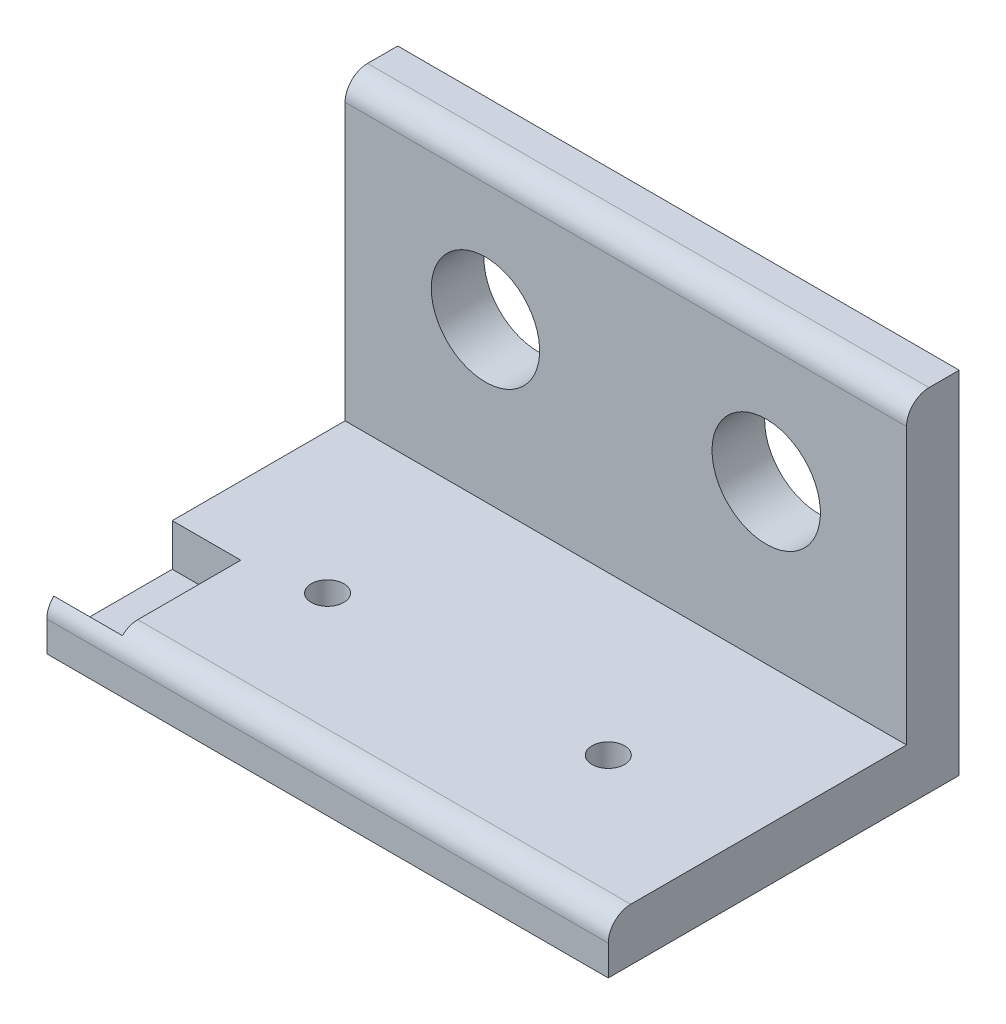
ISO-10303-21;
HEADER;
FILE_DESCRIPTION(('STEP AP214'),'2;1');
FILE_NAME('part.step','',(''),(''),'','','');
FILE_SCHEMA(('AUTOMOTIVE_DESIGN { 1 0 10303 214 1 1 1 1 }'));
ENDSEC;
DATA;
#1=APPLICATION_CONTEXT('core data for automotive mechanical design processes');
#2=APPLICATION_PROTOCOL_DEFINITION('international standard','automotive_design',2000,#1);
#3=PRODUCT_CONTEXT('',#1,'mechanical');
#4=PRODUCT('Part','Part','',(#3));
#5=PRODUCT_RELATED_PRODUCT_CATEGORY('part','',(#4));
#6=PRODUCT_DEFINITION_FORMATION('','',#4);
#7=PRODUCT_DEFINITION_CONTEXT('part definition',#1,'design');
#8=PRODUCT_DEFINITION('design','',#6,#7);
#9=PRODUCT_DEFINITION_SHAPE('','',#8);
#10=(LENGTH_UNIT() NAMED_UNIT(*) SI_UNIT(.MILLI.,.METRE.));
#11=(NAMED_UNIT(*) PLANE_ANGLE_UNIT() SI_UNIT($,.RADIAN.));
#12=(NAMED_UNIT(*) SI_UNIT($,.STERADIAN.) SOLID_ANGLE_UNIT());
#13=UNCERTAINTY_MEASURE_WITH_UNIT(LENGTH_MEASURE(1.E-05),#10,'distance_accuracy_value','');
#14=(GEOMETRIC_REPRESENTATION_CONTEXT(3) GLOBAL_UNCERTAINTY_ASSIGNED_CONTEXT((#13)) GLOBAL_UNIT_ASSIGNED_CONTEXT((#10,
#11,#12)) REPRESENTATION_CONTEXT('',''));
#15=CARTESIAN_POINT('',(0.,0.,0.));
#16=DIRECTION('',(0.,0.,1.));
#17=DIRECTION('',(1.,0.,0.));
#18=AXIS2_PLACEMENT_3D('',#15,#16,#17);
#19=CARTESIAN_POINT('',(0.,4.7625,0.));
#20=DIRECTION('',(0.,1.,0.));
#21=DIRECTION('',(0.,0.,1.));
#22=AXIS2_PLACEMENT_3D('',#19,#20,#21);
#23=PLANE('',#22);
#24=DIRECTION('',(-1.,0.,0.));
#25=VECTOR('',#24,1.);
#26=CARTESIAN_POINT('',(-0.348509109865628,4.7625,20.3992044382791));
#27=LINE('',#26,#25);
#28=CARTESIAN_POINT('',(6.20120884697613,4.7625,20.3992044382791));
#29=VERTEX_POINT('',#28);
#30=CARTESIAN_POINT('',(0.,4.7625,20.3992044382791));
#31=VERTEX_POINT('',#30);
#32=EDGE_CURVE('E132',#29,#31,#27,.T.);
#33=ORIENTED_EDGE('',*,*,#32,.F.);
#34=DIRECTION('',(0.,0.,-1.));
#35=VECTOR('',#34,1.);
#36=CARTESIAN_POINT('',(6.20120884697613,4.7625,31.1129814935099));
#37=LINE('',#36,#35);
#38=CARTESIAN_POINT('',(6.20120884697613,4.7625,29.718));
#39=VERTEX_POINT('',#38);
#40=EDGE_CURVE('E148',#39,#29,#37,.T.);
#41=ORIENTED_EDGE('',*,*,#40,.F.);
#42=DIRECTION('',(1.,0.,0.));
#43=VECTOR('',#42,1.);
#44=CARTESIAN_POINT('',(50.8,4.7625,29.718));
#45=LINE('',#44,#43);
#46=CARTESIAN_POINT('',(50.8,4.7625,29.718));
#47=VERTEX_POINT('',#46);
#48=EDGE_CURVE('E226',#39,#47,#45,.T.);
#49=ORIENTED_EDGE('',*,*,#48,.T.);
#50=DIRECTION('',(0.,0.,-1.));
#51=VECTOR('',#50,1.);
#52=CARTESIAN_POINT('',(50.8,4.7625,0.));
#53=LINE('',#52,#51);
#54=CARTESIAN_POINT('',(50.8,4.7625,4.7625));
#55=VERTEX_POINT('',#54);
#56=EDGE_CURVE('E192',#47,#55,#53,.T.);
#57=ORIENTED_EDGE('',*,*,#56,.T.);
#58=DIRECTION('',(-1.,0.,0.));
#59=VECTOR('',#58,1.);
#60=CARTESIAN_POINT('',(0.,4.7625,4.7625));
#61=LINE('',#60,#59);
#62=CARTESIAN_POINT('',(0.,4.7625,4.7625));
#63=VERTEX_POINT('',#62);
#64=EDGE_CURVE('E185',#55,#63,#61,.T.);
#65=ORIENTED_EDGE('',*,*,#64,.T.);
#66=DIRECTION('',(0.,0.,1.));
#67=VECTOR('',#66,1.);
#68=CARTESIAN_POINT('',(0.,4.7625,0.));
#69=LINE('',#68,#67);
#70=EDGE_CURVE('E189',#63,#31,#69,.T.);
#71=ORIENTED_EDGE('',*,*,#70,.T.);
#72=EDGE_LOOP('',(#33,#41,#49,#57,#65,#71));
#73=FACE_BOUND('',#72,.T.);
#74=CARTESIAN_POINT('',(38.1,4.7625,19.05));
#75=DIRECTION('',(0.,1.,0.));
#76=DIRECTION('',(0.,0.,1.));
#77=AXIS2_PLACEMENT_3D('',#74,#75,#76);
#78=CIRCLE('',#77,1.47319999999999);
#79=CARTESIAN_POINT('',(38.1,4.7625,20.5232));
#80=VERTEX_POINT('',#79);
#81=EDGE_CURVE('E164',#80,#80,#78,.T.);
#82=ORIENTED_EDGE('',*,*,#81,.F.);
#83=EDGE_LOOP('',(#82));
#84=FACE_BOUND('',#83,.T.);
#85=CARTESIAN_POINT('',(12.7,4.7625,19.05));
#86=DIRECTION('',(0.,1.,0.));
#87=DIRECTION('',(0.,0.,1.));
#88=AXIS2_PLACEMENT_3D('',#85,#86,#87);
#89=CIRCLE('',#88,1.47319999999999);
#90=CARTESIAN_POINT('',(12.7,4.7625,20.5232));
#91=VERTEX_POINT('',#90);
#92=EDGE_CURVE('E170',#91,#91,#89,.T.);
#93=ORIENTED_EDGE('',*,*,#92,.F.);
#94=EDGE_LOOP('',(#93));
#95=FACE_BOUND('',#94,.T.);
#96=ADVANCED_FACE('F34',(#73,#84,#95),#23,.T.);
#97=CARTESIAN_POINT('',(0.,4.7625,0.));
#98=DIRECTION('',(1.,0.,0.));
#99=DIRECTION('',(0.,0.,-1.));
#100=AXIS2_PLACEMENT_3D('',#97,#98,#99);
#101=PLANE('',#100);
#102=DIRECTION('',(0.,0.,-1.));
#103=VECTOR('',#102,1.);
#104=CARTESIAN_POINT('',(0.,0.952500000000001,0.));
#105=LINE('',#104,#103);
#106=CARTESIAN_POINT('',(0.,0.952500000000001,31.1129814935099));
#107=VERTEX_POINT('',#106);
#108=CARTESIAN_POINT('',(0.,0.952500000000001,20.3992044382791));
#109=VERTEX_POINT('',#108);
#110=EDGE_CURVE('E42',#107,#109,#105,.T.);
#111=ORIENTED_EDGE('',*,*,#110,.T.);
#112=DIRECTION('',(0.,1.,0.));
#113=VECTOR('',#112,1.);
#114=CARTESIAN_POINT('',(0.,4.7625,20.3992044382791));
#115=LINE('',#114,#113);
#116=EDGE_CURVE('E11',#109,#31,#115,.T.);
#117=ORIENTED_EDGE('',*,*,#116,.T.);
#118=ORIENTED_EDGE('',*,*,#70,.F.);
#119=DIRECTION('',(0.,-1.,0.));
#120=VECTOR('',#119,1.);
#121=CARTESIAN_POINT('',(0.,0.,4.7625));
#122=LINE('',#121,#120);
#123=CARTESIAN_POINT('',(0.,29.718,4.7625));
#124=VERTEX_POINT('',#123);
#125=EDGE_CURVE('E174',#124,#63,#122,.T.);
#126=ORIENTED_EDGE('',*,*,#125,.F.);
#127=CARTESIAN_POINT('',(0.,29.718,2.7305));
#128=DIRECTION('',(1.,0.,0.));
#129=DIRECTION('',(0.,0.,-1.));
#130=AXIS2_PLACEMENT_3D('',#127,#128,#129);
#131=CIRCLE('',#130,2.032);
#132=CARTESIAN_POINT('',(0.,31.75,2.7305));
#133=VERTEX_POINT('',#132);
#134=EDGE_CURVE('E219',#124,#133,#131,.F.);
#135=ORIENTED_EDGE('',*,*,#134,.T.);
#136=DIRECTION('',(0.,0.,-1.));
#137=VECTOR('',#136,1.);
#138=CARTESIAN_POINT('',(0.,31.75,4.7625));
#139=LINE('',#138,#137);
#140=CARTESIAN_POINT('',(0.,31.75,0.));
#141=VERTEX_POINT('',#140);
#142=EDGE_CURVE('E179',#133,#141,#139,.T.);
#143=ORIENTED_EDGE('',*,*,#142,.T.);
#144=DIRECTION('',(0.,-1.,0.));
#145=VECTOR('',#144,1.);
#146=CARTESIAN_POINT('',(0.,4.7625,0.));
#147=LINE('',#146,#145);
#148=CARTESIAN_POINT('',(0.,0.,0.));
#149=VERTEX_POINT('',#148);
#150=EDGE_CURVE('E195',#141,#149,#147,.T.);
#151=ORIENTED_EDGE('',*,*,#150,.T.);
#152=DIRECTION('',(0.,0.,1.));
#153=VECTOR('',#152,1.);
#154=CARTESIAN_POINT('',(0.,0.,0.));
#155=LINE('',#154,#153);
#156=CARTESIAN_POINT('',(0.,0.,31.75));
#157=VERTEX_POINT('',#156);
#158=EDGE_CURVE('E188',#149,#157,#155,.T.);
#159=ORIENTED_EDGE('',*,*,#158,.T.);
#160=DIRECTION('',(0.,-1.,0.));
#161=VECTOR('',#160,1.);
#162=CARTESIAN_POINT('',(0.,4.7625,31.75));
#163=LINE('',#162,#161);
#164=CARTESIAN_POINT('',(0.,2.7305,31.75));
#165=VERTEX_POINT('',#164);
#166=EDGE_CURVE('E211',#165,#157,#163,.T.);
#167=ORIENTED_EDGE('',*,*,#166,.F.);
#168=CARTESIAN_POINT('',(0.,2.7305,29.718));
#169=DIRECTION('',(1.,0.,0.));
#170=DIRECTION('',(0.,0.,-1.));
#171=AXIS2_PLACEMENT_3D('',#168,#169,#170);
#172=CIRCLE('',#171,2.032);
#173=CARTESIAN_POINT('',(0.,4.20801501947181,31.1129814935099));
#174=VERTEX_POINT('',#173);
#175=EDGE_CURVE('E216',#165,#174,#172,.F.);
#176=ORIENTED_EDGE('',*,*,#175,.T.);
#177=DIRECTION('',(0.,-1.,0.));
#178=VECTOR('',#177,1.);
#179=CARTESIAN_POINT('',(0.,4.7625,31.1129814935099));
#180=LINE('',#179,#178);
#181=EDGE_CURVE('E49',#174,#107,#180,.T.);
#182=ORIENTED_EDGE('',*,*,#181,.T.);
#183=EDGE_LOOP('',(#111,#117,#118,#126,#135,#143,#151,#159,#167,#176,#182));
#184=FACE_BOUND('',#183,.T.);
#185=ADVANCED_FACE('F237',(#184),#101,.F.);
#186=CARTESIAN_POINT('',(0.,4.7625,31.75));
#187=DIRECTION('',(0.,0.,-1.));
#188=DIRECTION('',(-1.,0.,0.));
#189=AXIS2_PLACEMENT_3D('',#186,#187,#188);
#190=PLANE('',#189);
#191=DIRECTION('',(0.,-1.,0.));
#192=VECTOR('',#191,1.);
#193=CARTESIAN_POINT('',(50.8,4.7625,31.75));
#194=LINE('',#193,#192);
#195=CARTESIAN_POINT('',(50.8,2.7305,31.75));
#196=VERTEX_POINT('',#195);
#197=CARTESIAN_POINT('',(50.8,0.,31.75));
#198=VERTEX_POINT('',#197);
#199=EDGE_CURVE('E209',#196,#198,#194,.T.);
#200=ORIENTED_EDGE('',*,*,#199,.F.);
#201=DIRECTION('',(1.,0.,0.));
#202=VECTOR('',#201,1.);
#203=CARTESIAN_POINT('',(0.,2.7305,31.75));
#204=LINE('',#203,#202);
#205=EDGE_CURVE('E228',#196,#165,#204,.F.);
#206=ORIENTED_EDGE('',*,*,#205,.T.);
#207=ORIENTED_EDGE('',*,*,#166,.T.);
#208=DIRECTION('',(1.,0.,0.));
#209=VECTOR('',#208,1.);
#210=CARTESIAN_POINT('',(0.,0.,31.75));
#211=LINE('',#210,#209);
#212=EDGE_CURVE('E198',#157,#198,#211,.T.);
#213=ORIENTED_EDGE('',*,*,#212,.T.);
#214=EDGE_LOOP('',(#200,#206,#207,#213));
#215=FACE_BOUND('',#214,.T.);
#216=ADVANCED_FACE('F267',(#215),#190,.F.);
#217=CARTESIAN_POINT('',(50.8,4.7625,0.));
#218=DIRECTION('',(-1.,0.,0.));
#219=DIRECTION('',(0.,0.,1.));
#220=AXIS2_PLACEMENT_3D('',#217,#218,#219);
#221=PLANE('',#220);
#222=DIRECTION('',(0.,0.,-1.));
#223=VECTOR('',#222,1.);
#224=CARTESIAN_POINT('',(50.8,31.75,4.7625));
#225=LINE('',#224,#223);
#226=CARTESIAN_POINT('',(50.8,31.75,2.7305));
#227=VERTEX_POINT('',#226);
#228=CARTESIAN_POINT('',(50.8,31.75,0.));
#229=VERTEX_POINT('',#228);
#230=EDGE_CURVE('E183',#227,#229,#225,.T.);
#231=ORIENTED_EDGE('',*,*,#230,.F.);
#232=CARTESIAN_POINT('',(50.8,29.718,2.7305));
#233=DIRECTION('',(-1.,0.,0.));
#234=DIRECTION('',(0.,0.,1.));
#235=AXIS2_PLACEMENT_3D('',#232,#233,#234);
#236=CIRCLE('',#235,2.032);
#237=CARTESIAN_POINT('',(50.8,29.718,4.7625));
#238=VERTEX_POINT('',#237);
#239=EDGE_CURVE('E224',#227,#238,#236,.F.);
#240=ORIENTED_EDGE('',*,*,#239,.T.);
#241=DIRECTION('',(0.,1.,0.));
#242=VECTOR('',#241,1.);
#243=CARTESIAN_POINT('',(50.8,0.,4.7625));
#244=LINE('',#243,#242);
#245=EDGE_CURVE('E176',#55,#238,#244,.T.);
#246=ORIENTED_EDGE('',*,*,#245,.F.);
#247=ORIENTED_EDGE('',*,*,#56,.F.);
#248=CARTESIAN_POINT('',(50.8,2.7305,29.718));
#249=DIRECTION('',(-1.,0.,0.));
#250=DIRECTION('',(0.,0.,1.));
#251=AXIS2_PLACEMENT_3D('',#248,#249,#250);
#252=CIRCLE('',#251,2.032);
#253=EDGE_CURVE('E57',#47,#196,#252,.F.);
#254=ORIENTED_EDGE('',*,*,#253,.T.);
#255=ORIENTED_EDGE('',*,*,#199,.T.);
#256=DIRECTION('',(0.,0.,-1.));
#257=VECTOR('',#256,1.);
#258=CARTESIAN_POINT('',(50.8,0.,0.));
#259=LINE('',#258,#257);
#260=CARTESIAN_POINT('',(50.8,0.,0.));
#261=VERTEX_POINT('',#260);
#262=EDGE_CURVE('E201',#198,#261,#259,.T.);
#263=ORIENTED_EDGE('',*,*,#262,.T.);
#264=DIRECTION('',(0.,-1.,0.));
#265=VECTOR('',#264,1.);
#266=CARTESIAN_POINT('',(50.8,4.7625,0.));
#267=LINE('',#266,#265);
#268=EDGE_CURVE('E206',#229,#261,#267,.T.);
#269=ORIENTED_EDGE('',*,*,#268,.F.);
#270=EDGE_LOOP('',(#231,#240,#246,#247,#254,#255,#263,#269));
#271=FACE_BOUND('',#270,.T.);
#272=ADVANCED_FACE('F280',(#271),#221,.F.);
#273=CARTESIAN_POINT('',(0.,4.7625,0.));
#274=DIRECTION('',(0.,0.,1.));
#275=DIRECTION('',(1.,0.,0.));
#276=AXIS2_PLACEMENT_3D('',#273,#274,#275);
#277=PLANE('',#276);
#278=CARTESIAN_POINT('',(12.7,19.05,0.));
#279=DIRECTION('',(0.,0.,-1.));
#280=DIRECTION('',(-1.,0.,0.));
#281=AXIS2_PLACEMENT_3D('',#278,#279,#280);
#282=CIRCLE('',#281,4.90219999999999);
#283=CARTESIAN_POINT('',(7.79780000000001,19.05,0.));
#284=VERTEX_POINT('',#283);
#285=EDGE_CURVE('E153',#284,#284,#282,.T.);
#286=ORIENTED_EDGE('',*,*,#285,.F.);
#287=EDGE_LOOP('',(#286));
#288=FACE_BOUND('',#287,.T.);
#289=CARTESIAN_POINT('',(38.1,19.05,0.));
#290=DIRECTION('',(0.,0.,-1.));
#291=DIRECTION('',(-1.,0.,0.));
#292=AXIS2_PLACEMENT_3D('',#289,#290,#291);
#293=CIRCLE('',#292,4.90219999999999);
#294=CARTESIAN_POINT('',(33.1978,19.05,0.));
#295=VERTEX_POINT('',#294);
#296=EDGE_CURVE('E157',#295,#295,#293,.T.);
#297=ORIENTED_EDGE('',*,*,#296,.F.);
#298=EDGE_LOOP('',(#297));
#299=FACE_BOUND('',#298,.T.);
#300=DIRECTION('',(-1.,0.,0.));
#301=VECTOR('',#300,1.);
#302=CARTESIAN_POINT('',(0.,0.,0.));
#303=LINE('',#302,#301);
#304=EDGE_CURVE('E193',#261,#149,#303,.T.);
#305=ORIENTED_EDGE('',*,*,#304,.T.);
#306=ORIENTED_EDGE('',*,*,#150,.F.);
#307=DIRECTION('',(-1.,0.,0.));
#308=VECTOR('',#307,1.);
#309=CARTESIAN_POINT('',(0.,31.75,0.));
#310=LINE('',#309,#308);
#311=EDGE_CURVE('E173',#229,#141,#310,.T.);
#312=ORIENTED_EDGE('',*,*,#311,.F.);
#313=ORIENTED_EDGE('',*,*,#268,.T.);
#314=EDGE_LOOP('',(#305,#306,#312,#313));
#315=FACE_BOUND('',#314,.T.);
#316=ADVANCED_FACE('F276',(#288,#299,#315),#277,.F.);
#317=CARTESIAN_POINT('',(0.,0.,0.));
#318=DIRECTION('',(0.,1.,0.));
#319=DIRECTION('',(0.,0.,1.));
#320=AXIS2_PLACEMENT_3D('',#317,#318,#319);
#321=PLANE('',#320);
#322=CARTESIAN_POINT('',(38.1,0.,19.05));
#323=DIRECTION('',(0.,-1.,0.));
#324=DIRECTION('',(0.,0.,-1.));
#325=AXIS2_PLACEMENT_3D('',#322,#323,#324);
#326=CIRCLE('',#325,1.47319999999999);
#327=CARTESIAN_POINT('',(38.1,0.,17.5768));
#328=VERTEX_POINT('',#327);
#329=EDGE_CURVE('E161',#328,#328,#326,.T.);
#330=ORIENTED_EDGE('',*,*,#329,.F.);
#331=EDGE_LOOP('',(#330));
#332=FACE_BOUND('',#331,.T.);
#333=CARTESIAN_POINT('',(12.7,0.,19.05));
#334=DIRECTION('',(0.,-1.,0.));
#335=DIRECTION('',(0.,0.,-1.));
#336=AXIS2_PLACEMENT_3D('',#333,#334,#335);
#337=CIRCLE('',#336,1.47319999999999);
#338=CARTESIAN_POINT('',(12.7,0.,17.5768));
#339=VERTEX_POINT('',#338);
#340=EDGE_CURVE('E167',#339,#339,#337,.T.);
#341=ORIENTED_EDGE('',*,*,#340,.F.);
#342=EDGE_LOOP('',(#341));
#343=FACE_BOUND('',#342,.T.);
#344=ORIENTED_EDGE('',*,*,#304,.F.);
#345=ORIENTED_EDGE('',*,*,#262,.F.);
#346=ORIENTED_EDGE('',*,*,#212,.F.);
#347=ORIENTED_EDGE('',*,*,#158,.F.);
#348=EDGE_LOOP('',(#344,#345,#346,#347));
#349=FACE_BOUND('',#348,.T.);
#350=ADVANCED_FACE('F273',(#332,#343,#349),#321,.F.);
#351=CARTESIAN_POINT('',(0.,31.75,4.7625));
#352=DIRECTION('',(0.,-1.,0.));
#353=DIRECTION('',(0.,0.,-1.));
#354=AXIS2_PLACEMENT_3D('',#351,#352,#353);
#355=PLANE('',#354);
#356=ORIENTED_EDGE('',*,*,#142,.F.);
#357=DIRECTION('',(-1.,0.,0.));
#358=VECTOR('',#357,1.);
#359=CARTESIAN_POINT('',(0.,31.75,2.7305));
#360=LINE('',#359,#358);
#361=EDGE_CURVE('E221',#133,#227,#360,.F.);
#362=ORIENTED_EDGE('',*,*,#361,.T.);
#363=ORIENTED_EDGE('',*,*,#230,.T.);
#364=ORIENTED_EDGE('',*,*,#311,.T.);
#365=EDGE_LOOP('',(#356,#362,#363,#364));
#366=FACE_BOUND('',#365,.T.);
#367=ADVANCED_FACE('F271',(#366),#355,.F.);
#368=CARTESIAN_POINT('',(0.,0.,4.7625));
#369=DIRECTION('',(0.,0.,-1.));
#370=DIRECTION('',(-1.,0.,0.));
#371=AXIS2_PLACEMENT_3D('',#368,#369,#370);
#372=PLANE('',#371);
#373=CARTESIAN_POINT('',(12.7,19.05,4.7625));
#374=DIRECTION('',(0.,0.,-1.));
#375=DIRECTION('',(-1.,0.,0.));
#376=AXIS2_PLACEMENT_3D('',#373,#374,#375);
#377=CIRCLE('',#376,4.90219999999999);
#378=CARTESIAN_POINT('',(7.79780000000001,19.05,4.7625));
#379=VERTEX_POINT('',#378);
#380=EDGE_CURVE('E156',#379,#379,#377,.T.);
#381=ORIENTED_EDGE('',*,*,#380,.T.);
#382=EDGE_LOOP('',(#381));
#383=FACE_BOUND('',#382,.T.);
#384=CARTESIAN_POINT('',(38.1,19.05,4.7625));
#385=DIRECTION('',(0.,0.,-1.));
#386=DIRECTION('',(-1.,0.,0.));
#387=AXIS2_PLACEMENT_3D('',#384,#385,#386);
#388=CIRCLE('',#387,4.90219999999999);
#389=CARTESIAN_POINT('',(33.1978,19.05,4.7625));
#390=VERTEX_POINT('',#389);
#391=EDGE_CURVE('E160',#390,#390,#388,.T.);
#392=ORIENTED_EDGE('',*,*,#391,.T.);
#393=EDGE_LOOP('',(#392));
#394=FACE_BOUND('',#393,.T.);
#395=ORIENTED_EDGE('',*,*,#245,.T.);
#396=DIRECTION('',(-1.,0.,0.));
#397=VECTOR('',#396,1.);
#398=CARTESIAN_POINT('',(0.,29.718,4.7625));
#399=LINE('',#398,#397);
#400=EDGE_CURVE('E213',#238,#124,#399,.T.);
#401=ORIENTED_EDGE('',*,*,#400,.T.);
#402=ORIENTED_EDGE('',*,*,#125,.T.);
#403=ORIENTED_EDGE('',*,*,#64,.F.);
#404=EDGE_LOOP('',(#395,#401,#402,#403));
#405=FACE_BOUND('',#404,.T.);
#406=ADVANCED_FACE('F288',(#383,#394,#405),#372,.F.);
#407=CARTESIAN_POINT('',(0.,29.718,2.7305));
#408=DIRECTION('',(-1.,0.,0.));
#409=DIRECTION('',(0.,0.,1.));
#410=AXIS2_PLACEMENT_3D('',#407,#408,#409);
#411=CYLINDRICAL_SURFACE('',#410,2.032);
#412=ORIENTED_EDGE('',*,*,#239,.F.);
#413=ORIENTED_EDGE('',*,*,#361,.F.);
#414=ORIENTED_EDGE('',*,*,#134,.F.);
#415=ORIENTED_EDGE('',*,*,#400,.F.);
#416=EDGE_LOOP('',(#412,#413,#414,#415));
#417=FACE_BOUND('',#416,.T.);
#418=ADVANCED_FACE('F286',(#417),#411,.T.);
#419=CARTESIAN_POINT('',(0.,2.7305,29.718));
#420=DIRECTION('',(-1.,0.,0.));
#421=DIRECTION('',(0.,0.,1.));
#422=AXIS2_PLACEMENT_3D('',#419,#420,#421);
#423=CYLINDRICAL_SURFACE('',#422,2.032);
#424=CARTESIAN_POINT('',(6.20120884697613,2.7305,29.718));
#425=DIRECTION('',(1.,0.,0.));
#426=DIRECTION('',(0.,0.,-1.));
#427=AXIS2_PLACEMENT_3D('',#424,#425,#426);
#428=CIRCLE('',#427,2.032);
#429=CARTESIAN_POINT('',(6.20120884697613,4.20801501947181,31.1129814935099));
#430=VERTEX_POINT('',#429);
#431=EDGE_CURVE('E235',#430,#39,#428,.F.);
#432=ORIENTED_EDGE('',*,*,#431,.F.);
#433=DIRECTION('',(-1.,0.,0.));
#434=VECTOR('',#433,1.);
#435=CARTESIAN_POINT('',(0.,4.20801501947181,31.1129814935099));
#436=LINE('',#435,#434);
#437=EDGE_CURVE('E137',#174,#430,#436,.F.);
#438=ORIENTED_EDGE('',*,*,#437,.F.);
#439=ORIENTED_EDGE('',*,*,#175,.F.);
#440=ORIENTED_EDGE('',*,*,#205,.F.);
#441=ORIENTED_EDGE('',*,*,#253,.F.);
#442=ORIENTED_EDGE('',*,*,#48,.F.);
#443=EDGE_LOOP('',(#432,#438,#439,#440,#441,#442));
#444=FACE_BOUND('',#443,.T.);
#445=ADVANCED_FACE('F36',(#444),#423,.T.);
#446=CARTESIAN_POINT('',(12.7,0.,19.05));
#447=DIRECTION('',(0.,-1.,0.));
#448=DIRECTION('',(0.,0.,-1.));
#449=AXIS2_PLACEMENT_3D('',#446,#447,#448);
#450=CYLINDRICAL_SURFACE('',#449,1.47319999999999);
#451=ORIENTED_EDGE('',*,*,#92,.T.);
#452=EDGE_LOOP('',(#451));
#453=FACE_BOUND('',#452,.T.);
#454=ORIENTED_EDGE('',*,*,#340,.T.);
#455=EDGE_LOOP('',(#454));
#456=FACE_BOUND('',#455,.T.);
#457=ADVANCED_FACE('F294',(#453,#456),#450,.F.);
#458=CARTESIAN_POINT('',(38.1,0.,19.05));
#459=DIRECTION('',(0.,-1.,0.));
#460=DIRECTION('',(0.,0.,-1.));
#461=AXIS2_PLACEMENT_3D('',#458,#459,#460);
#462=CYLINDRICAL_SURFACE('',#461,1.47319999999999);
#463=ORIENTED_EDGE('',*,*,#81,.T.);
#464=EDGE_LOOP('',(#463));
#465=FACE_BOUND('',#464,.T.);
#466=ORIENTED_EDGE('',*,*,#329,.T.);
#467=EDGE_LOOP('',(#466));
#468=FACE_BOUND('',#467,.T.);
#469=ADVANCED_FACE('F339',(#465,#468),#462,.F.);
#470=CARTESIAN_POINT('',(38.1,19.05,0.));
#471=DIRECTION('',(0.,0.,-1.));
#472=DIRECTION('',(-1.,0.,0.));
#473=AXIS2_PLACEMENT_3D('',#470,#471,#472);
#474=CYLINDRICAL_SURFACE('',#473,4.90219999999999);
#475=ORIENTED_EDGE('',*,*,#296,.T.);
#476=EDGE_LOOP('',(#475));
#477=FACE_BOUND('',#476,.T.);
#478=ORIENTED_EDGE('',*,*,#391,.F.);
#479=EDGE_LOOP('',(#478));
#480=FACE_BOUND('',#479,.T.);
#481=ADVANCED_FACE('F258',(#477,#480),#474,.F.);
#482=CARTESIAN_POINT('',(12.7,19.05,0.));
#483=DIRECTION('',(0.,0.,-1.));
#484=DIRECTION('',(-1.,0.,0.));
#485=AXIS2_PLACEMENT_3D('',#482,#483,#484);
#486=CYLINDRICAL_SURFACE('',#485,4.90219999999999);
#487=ORIENTED_EDGE('',*,*,#285,.T.);
#488=EDGE_LOOP('',(#487));
#489=FACE_BOUND('',#488,.T.);
#490=ORIENTED_EDGE('',*,*,#380,.F.);
#491=EDGE_LOOP('',(#490));
#492=FACE_BOUND('',#491,.T.);
#493=ADVANCED_FACE('F251',(#489,#492),#486,.F.);
#494=CARTESIAN_POINT('',(-0.348509109865628,0.952500000000001,20.3992044382791));
#495=DIRECTION('',(0.,0.,-1.));
#496=DIRECTION('',(-1.,0.,0.));
#497=AXIS2_PLACEMENT_3D('',#494,#495,#496);
#498=PLANE('',#497);
#499=DIRECTION('',(-1.,0.,0.));
#500=VECTOR('',#499,1.);
#501=CARTESIAN_POINT('',(-0.348509109865628,0.952500000000001,20.3992044382791));
#502=LINE('',#501,#500);
#503=CARTESIAN_POINT('',(6.20120884697613,0.952500000000001,20.3992044382791));
#504=VERTEX_POINT('',#503);
#505=EDGE_CURVE('E141',#504,#109,#502,.T.);
#506=ORIENTED_EDGE('',*,*,#505,.F.);
#507=DIRECTION('',(0.,1.,0.));
#508=VECTOR('',#507,1.);
#509=CARTESIAN_POINT('',(6.20120884697613,0.952500000000001,20.3992044382791));
#510=LINE('',#509,#508);
#511=EDGE_CURVE('E140',#504,#29,#510,.T.);
#512=ORIENTED_EDGE('',*,*,#511,.T.);
#513=ORIENTED_EDGE('',*,*,#32,.T.);
#514=ORIENTED_EDGE('',*,*,#116,.F.);
#515=EDGE_LOOP('',(#506,#512,#513,#514));
#516=FACE_BOUND('',#515,.T.);
#517=ADVANCED_FACE('F249',(#516),#498,.F.);
#518=CARTESIAN_POINT('',(0.,0.952500000000001,0.));
#519=DIRECTION('',(0.,-1.,0.));
#520=DIRECTION('',(0.,0.,-1.));
#521=AXIS2_PLACEMENT_3D('',#518,#519,#520);
#522=PLANE('',#521);
#523=DIRECTION('',(1.,0.,0.));
#524=VECTOR('',#523,1.);
#525=CARTESIAN_POINT('',(-0.348509109865628,0.952500000000001,31.1129814935099));
#526=LINE('',#525,#524);
#527=CARTESIAN_POINT('',(6.20120884697613,0.952500000000001,31.1129814935099));
#528=VERTEX_POINT('',#527);
#529=EDGE_CURVE('E124',#107,#528,#526,.T.);
#530=ORIENTED_EDGE('',*,*,#529,.T.);
#531=DIRECTION('',(0.,0.,-1.));
#532=VECTOR('',#531,1.);
#533=CARTESIAN_POINT('',(6.20120884697613,0.952500000000001,31.1129814935099));
#534=LINE('',#533,#532);
#535=EDGE_CURVE('E129',#528,#504,#534,.T.);
#536=ORIENTED_EDGE('',*,*,#535,.T.);
#537=ORIENTED_EDGE('',*,*,#505,.T.);
#538=ORIENTED_EDGE('',*,*,#110,.F.);
#539=EDGE_LOOP('',(#530,#536,#537,#538));
#540=FACE_BOUND('',#539,.T.);
#541=ADVANCED_FACE('F126',(#540),#522,.F.);
#542=CARTESIAN_POINT('',(-0.348509109865628,0.952500000000001,31.1129814935099));
#543=DIRECTION('',(0.,0.,1.));
#544=DIRECTION('',(1.,0.,0.));
#545=AXIS2_PLACEMENT_3D('',#542,#543,#544);
#546=PLANE('',#545);
#547=ORIENTED_EDGE('',*,*,#437,.T.);
#548=DIRECTION('',(0.,1.,0.));
#549=VECTOR('',#548,1.);
#550=CARTESIAN_POINT('',(6.20120884697613,0.952500000000001,31.1129814935099));
#551=LINE('',#550,#549);
#552=EDGE_CURVE('E135',#528,#430,#551,.T.);
#553=ORIENTED_EDGE('',*,*,#552,.F.);
#554=ORIENTED_EDGE('',*,*,#529,.F.);
#555=ORIENTED_EDGE('',*,*,#181,.F.);
#556=EDGE_LOOP('',(#547,#553,#554,#555));
#557=FACE_BOUND('',#556,.T.);
#558=ADVANCED_FACE('F136',(#557),#546,.F.);
#559=CARTESIAN_POINT('',(6.20120884697613,0.952500000000001,31.1129814935099));
#560=DIRECTION('',(1.,0.,0.));
#561=DIRECTION('',(0.,0.,-1.));
#562=AXIS2_PLACEMENT_3D('',#559,#560,#561);
#563=PLANE('',#562);
#564=ORIENTED_EDGE('',*,*,#431,.T.);
#565=ORIENTED_EDGE('',*,*,#40,.T.);
#566=ORIENTED_EDGE('',*,*,#511,.F.);
#567=ORIENTED_EDGE('',*,*,#535,.F.);
#568=ORIENTED_EDGE('',*,*,#552,.T.);
#569=EDGE_LOOP('',(#564,#565,#566,#567,#568));
#570=FACE_BOUND('',#569,.T.);
#571=ADVANCED_FACE('F143',(#570),#563,.F.);
#572=CLOSED_SHELL('',(#96,#185,#216,#272,#316,#350,#367,#406,#418,#445,#457,#469,#481,#493,#517,
#541,#558,#571));
#573=MANIFOLD_SOLID_BREP('B2',#572);
#574=ADVANCED_BREP_SHAPE_REPRESENTATION('',(#18,#573),#14);
#575=SHAPE_DEFINITION_REPRESENTATION(#9,#574);
ENDSEC;
END-ISO-10303-21;
